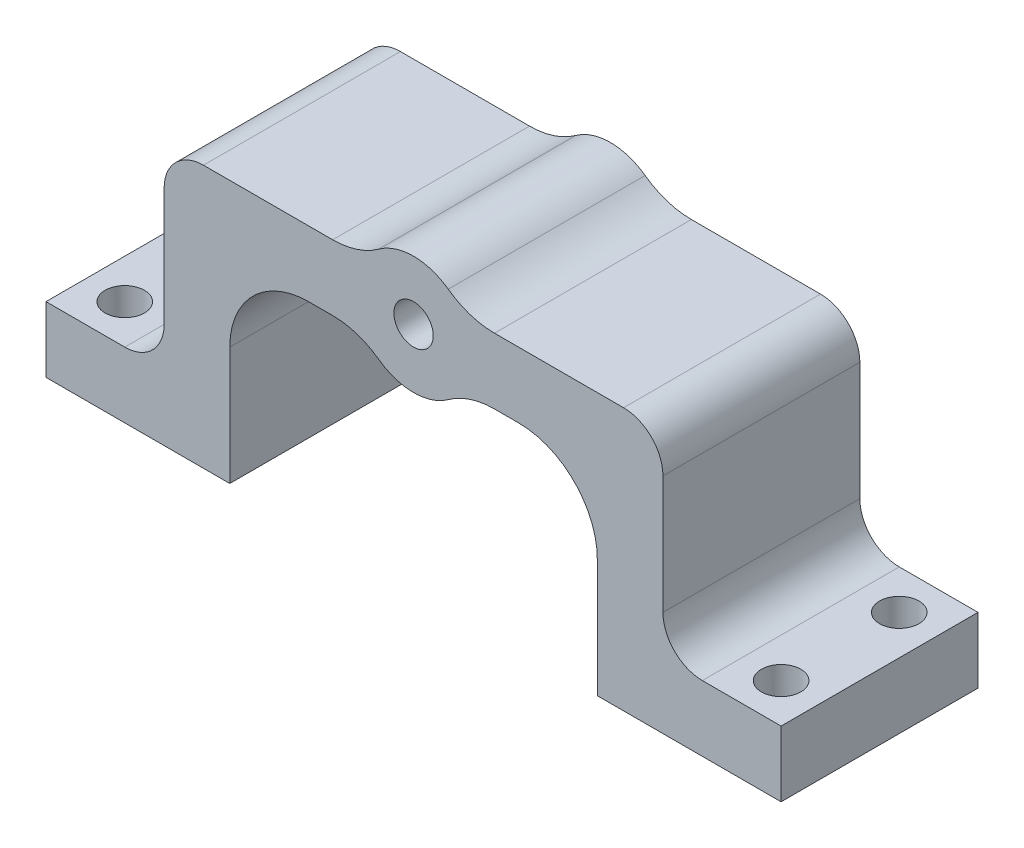
ISO-10303-21;
HEADER;
FILE_DESCRIPTION(('STEP AP214'),'2;1');
FILE_NAME('part.step','',(''),(''),'','','');
FILE_SCHEMA(('AUTOMOTIVE_DESIGN { 1 0 10303 214 1 1 1 1 }'));
ENDSEC;
DATA;
#1=APPLICATION_CONTEXT('core data for automotive mechanical design processes');
#2=APPLICATION_PROTOCOL_DEFINITION('international standard','automotive_design',2000,#1);
#3=PRODUCT_CONTEXT('',#1,'mechanical');
#4=PRODUCT('Part','Part','',(#3));
#5=PRODUCT_RELATED_PRODUCT_CATEGORY('part','',(#4));
#6=PRODUCT_DEFINITION_FORMATION('','',#4);
#7=PRODUCT_DEFINITION_CONTEXT('part definition',#1,'design');
#8=PRODUCT_DEFINITION('design','',#6,#7);
#9=PRODUCT_DEFINITION_SHAPE('','',#8);
#10=(LENGTH_UNIT() NAMED_UNIT(*) SI_UNIT(.MILLI.,.METRE.));
#11=(NAMED_UNIT(*) PLANE_ANGLE_UNIT() SI_UNIT($,.RADIAN.));
#12=(NAMED_UNIT(*) SI_UNIT($,.STERADIAN.) SOLID_ANGLE_UNIT());
#13=UNCERTAINTY_MEASURE_WITH_UNIT(LENGTH_MEASURE(1.E-05),#10,'distance_accuracy_value','');
#14=(GEOMETRIC_REPRESENTATION_CONTEXT(3) GLOBAL_UNCERTAINTY_ASSIGNED_CONTEXT((#13)) GLOBAL_UNIT_ASSIGNED_CONTEXT((#10,
#11,#12)) REPRESENTATION_CONTEXT('',''));
#15=CARTESIAN_POINT('',(0.,0.,0.));
#16=DIRECTION('',(0.,0.,1.));
#17=DIRECTION('',(1.,0.,0.));
#18=AXIS2_PLACEMENT_3D('',#15,#16,#17);
#19=CARTESIAN_POINT('',(0.,4.99999999999999,7.5));
#20=DIRECTION('',(0.,1.,0.));
#21=DIRECTION('',(-1.,0.,0.));
#22=AXIS2_PLACEMENT_3D('',#19,#20,#21);
#23=PLANE('',#22);
#24=CARTESIAN_POINT('',(-25.,5.,4.5));
#25=DIRECTION('',(0.,-1.,0.));
#26=DIRECTION('',(1.,0.,0.));
#27=AXIS2_PLACEMENT_3D('',#24,#25,#26);
#28=CIRCLE('',#27,1.5);
#29=CARTESIAN_POINT('',(-23.5,5.,4.5));
#30=VERTEX_POINT('',#29);
#31=EDGE_CURVE('E372',#30,#30,#28,.T.);
#32=ORIENTED_EDGE('',*,*,#31,.T.);
#33=EDGE_LOOP('',(#32));
#34=FACE_BOUND('',#33,.T.);
#35=DIRECTION('',(1.,0.,0.));
#36=VECTOR('',#35,1.);
#37=CARTESIAN_POINT('',(0.,4.99999999999999,7.5));
#38=LINE('',#37,#36);
#39=CARTESIAN_POINT('',(-28.,5.,7.5));
#40=VERTEX_POINT('',#39);
#41=CARTESIAN_POINT('',(-22.,5.,7.5));
#42=VERTEX_POINT('',#41);
#43=EDGE_CURVE('E258',#40,#42,#38,.T.);
#44=ORIENTED_EDGE('',*,*,#43,.T.);
#45=DIRECTION('',(0.,0.,-1.));
#46=VECTOR('',#45,1.);
#47=CARTESIAN_POINT('',(-22.,5.,-7.5));
#48=LINE('',#47,#46);
#49=CARTESIAN_POINT('',(-22.,5.,-7.5));
#50=VERTEX_POINT('',#49);
#51=EDGE_CURVE('E336',#42,#50,#48,.T.);
#52=ORIENTED_EDGE('',*,*,#51,.T.);
#53=DIRECTION('',(1.,0.,0.));
#54=VECTOR('',#53,1.);
#55=CARTESIAN_POINT('',(0.,4.99999999999999,-7.5));
#56=LINE('',#55,#54);
#57=CARTESIAN_POINT('',(-28.,5.,-7.5));
#58=VERTEX_POINT('',#57);
#59=EDGE_CURVE('E291',#58,#50,#56,.T.);
#60=ORIENTED_EDGE('',*,*,#59,.F.);
#61=DIRECTION('',(0.,0.,-1.));
#62=VECTOR('',#61,1.);
#63=CARTESIAN_POINT('',(-28.,5.,7.5));
#64=LINE('',#63,#62);
#65=EDGE_CURVE('E306',#40,#58,#64,.T.);
#66=ORIENTED_EDGE('',*,*,#65,.F.);
#67=EDGE_LOOP('',(#44,#52,#60,#66));
#68=FACE_BOUND('',#67,.T.);
#69=CARTESIAN_POINT('',(-25.,5.,-4.5));
#70=DIRECTION('',(0.,-1.,0.));
#71=DIRECTION('',(1.,0.,0.));
#72=AXIS2_PLACEMENT_3D('',#69,#70,#71);
#73=CIRCLE('',#72,1.5);
#74=CARTESIAN_POINT('',(-23.5,5.,-4.5));
#75=VERTEX_POINT('',#74);
#76=EDGE_CURVE('E376',#75,#75,#73,.T.);
#77=ORIENTED_EDGE('',*,*,#76,.T.);
#78=EDGE_LOOP('',(#77));
#79=FACE_BOUND('',#78,.T.);
#80=ADVANCED_FACE('F39',(#34,#68,#79),#23,.T.);
#81=CARTESIAN_POINT('',(0.,0.,7.5));
#82=DIRECTION('',(0.,1.,0.));
#83=DIRECTION('',(0.,0.,1.));
#84=AXIS2_PLACEMENT_3D('',#81,#82,#83);
#85=PLANE('',#84);
#86=CARTESIAN_POINT('',(-25.,0.,4.5));
#87=DIRECTION('',(0.,1.,0.));
#88=DIRECTION('',(0.,0.,1.));
#89=AXIS2_PLACEMENT_3D('',#86,#87,#88);
#90=CIRCLE('',#89,1.5);
#91=CARTESIAN_POINT('',(-25.,0.,6.));
#92=VERTEX_POINT('',#91);
#93=EDGE_CURVE('E368',#92,#92,#90,.F.);
#94=ORIENTED_EDGE('',*,*,#93,.F.);
#95=EDGE_LOOP('',(#94));
#96=FACE_BOUND('',#95,.T.);
#97=DIRECTION('',(1.,0.,0.));
#98=VECTOR('',#97,1.);
#99=CARTESIAN_POINT('',(0.,0.,-7.5));
#100=LINE('',#99,#98);
#101=CARTESIAN_POINT('',(-28.,0.,-7.5));
#102=VERTEX_POINT('',#101);
#103=CARTESIAN_POINT('',(-14.,0.,-7.5));
#104=VERTEX_POINT('',#103);
#105=EDGE_CURVE('E297',#102,#104,#100,.T.);
#106=ORIENTED_EDGE('',*,*,#105,.T.);
#107=DIRECTION('',(0.,0.,-1.));
#108=VECTOR('',#107,1.);
#109=CARTESIAN_POINT('',(-14.,0.,7.5));
#110=LINE('',#109,#108);
#111=CARTESIAN_POINT('',(-14.,0.,7.5));
#112=VERTEX_POINT('',#111);
#113=EDGE_CURVE('E269',#112,#104,#110,.T.);
#114=ORIENTED_EDGE('',*,*,#113,.F.);
#115=DIRECTION('',(1.,0.,0.));
#116=VECTOR('',#115,1.);
#117=CARTESIAN_POINT('',(0.,0.,7.5));
#118=LINE('',#117,#116);
#119=CARTESIAN_POINT('',(-28.,0.,7.5));
#120=VERTEX_POINT('',#119);
#121=EDGE_CURVE('E264',#120,#112,#118,.T.);
#122=ORIENTED_EDGE('',*,*,#121,.F.);
#123=DIRECTION('',(0.,0.,-1.));
#124=VECTOR('',#123,1.);
#125=CARTESIAN_POINT('',(-28.,0.,7.5));
#126=LINE('',#125,#124);
#127=EDGE_CURVE('E304',#120,#102,#126,.T.);
#128=ORIENTED_EDGE('',*,*,#127,.T.);
#129=EDGE_LOOP('',(#106,#114,#122,#128));
#130=FACE_BOUND('',#129,.T.);
#131=CARTESIAN_POINT('',(-25.,0.,-4.5));
#132=DIRECTION('',(0.,1.,0.));
#133=DIRECTION('',(0.,0.,1.));
#134=AXIS2_PLACEMENT_3D('',#131,#132,#133);
#135=CIRCLE('',#134,1.5);
#136=CARTESIAN_POINT('',(-25.,0.,-3.));
#137=VERTEX_POINT('',#136);
#138=EDGE_CURVE('E373',#137,#137,#135,.F.);
#139=ORIENTED_EDGE('',*,*,#138,.F.);
#140=EDGE_LOOP('',(#139));
#141=FACE_BOUND('',#140,.T.);
#142=ADVANCED_FACE('F486',(#96,#130,#141),#85,.F.);
#143=CARTESIAN_POINT('',(0.,15.,7.5));
#144=DIRECTION('',(0.,1.,0.));
#145=DIRECTION('',(0.,0.,1.));
#146=AXIS2_PLACEMENT_3D('',#143,#144,#145);
#147=PLANE('',#146);
#148=DIRECTION('',(1.,0.,0.));
#149=VECTOR('',#148,1.);
#150=CARTESIAN_POINT('',(0.,15.,-7.5));
#151=LINE('',#150,#149);
#152=CARTESIAN_POINT('',(-8.,15.,-7.5));
#153=VERTEX_POINT('',#152);
#154=CARTESIAN_POINT('',(-6.16441400296897,15.,-7.5));
#155=VERTEX_POINT('',#154);
#156=EDGE_CURVE('E270',#153,#155,#151,.T.);
#157=ORIENTED_EDGE('',*,*,#156,.T.);
#158=DIRECTION('',(0.,0.,1.));
#159=VECTOR('',#158,1.);
#160=CARTESIAN_POINT('',(-6.16441400296897,15.,7.5));
#161=LINE('',#160,#159);
#162=CARTESIAN_POINT('',(-6.16441400296897,15.,7.5));
#163=VERTEX_POINT('',#162);
#164=EDGE_CURVE('E383',#155,#163,#161,.T.);
#165=ORIENTED_EDGE('',*,*,#164,.T.);
#166=DIRECTION('',(1.,0.,0.));
#167=VECTOR('',#166,1.);
#168=CARTESIAN_POINT('',(0.,15.,7.5));
#169=LINE('',#168,#167);
#170=CARTESIAN_POINT('',(-8.,15.,7.5));
#171=VERTEX_POINT('',#170);
#172=EDGE_CURVE('E238',#171,#163,#169,.T.);
#173=ORIENTED_EDGE('',*,*,#172,.F.);
#174=DIRECTION('',(0.,0.,-1.));
#175=VECTOR('',#174,1.);
#176=CARTESIAN_POINT('',(-8.,15.,-7.5));
#177=LINE('',#176,#175);
#178=EDGE_CURVE('E351',#171,#153,#177,.T.);
#179=ORIENTED_EDGE('',*,*,#178,.T.);
#180=EDGE_LOOP('',(#157,#165,#173,#179));
#181=FACE_BOUND('',#180,.T.);
#182=ADVANCED_FACE('F488',(#181),#147,.F.);
#183=CARTESIAN_POINT('',(0.,20.,7.5));
#184=DIRECTION('',(0.,-1.,0.));
#185=DIRECTION('',(0.,0.,-1.));
#186=AXIS2_PLACEMENT_3D('',#183,#184,#185);
#187=PLANE('',#186);
#188=DIRECTION('',(-1.,0.,0.));
#189=VECTOR('',#188,1.);
#190=CARTESIAN_POINT('',(0.,20.,-7.5));
#191=LINE('',#190,#189);
#192=CARTESIAN_POINT('',(16.,20.,-7.5));
#193=VERTEX_POINT('',#192);
#194=CARTESIAN_POINT('',(6.16441400296898,20.,-7.5));
#195=VERTEX_POINT('',#194);
#196=EDGE_CURVE('E286',#193,#195,#191,.T.);
#197=ORIENTED_EDGE('',*,*,#196,.T.);
#198=DIRECTION('',(0.,0.,1.));
#199=VECTOR('',#198,1.);
#200=CARTESIAN_POINT('',(6.16441400296898,20.,7.5));
#201=LINE('',#200,#199);
#202=CARTESIAN_POINT('',(6.16441400296898,20.,7.5));
#203=VERTEX_POINT('',#202);
#204=EDGE_CURVE('E393',#195,#203,#201,.T.);
#205=ORIENTED_EDGE('',*,*,#204,.T.);
#206=DIRECTION('',(-1.,0.,0.));
#207=VECTOR('',#206,1.);
#208=CARTESIAN_POINT('',(0.,20.,7.5));
#209=LINE('',#208,#207);
#210=CARTESIAN_POINT('',(16.,20.,7.5));
#211=VERTEX_POINT('',#210);
#212=EDGE_CURVE('E253',#211,#203,#209,.T.);
#213=ORIENTED_EDGE('',*,*,#212,.F.);
#214=DIRECTION('',(0.,0.,-1.));
#215=VECTOR('',#214,1.);
#216=CARTESIAN_POINT('',(16.,20.,7.5));
#217=LINE('',#216,#215);
#218=EDGE_CURVE('E314',#211,#193,#217,.T.);
#219=ORIENTED_EDGE('',*,*,#218,.T.);
#220=EDGE_LOOP('',(#197,#205,#213,#219));
#221=FACE_BOUND('',#220,.T.);
#222=ADVANCED_FACE('F419',(#221),#187,.F.);
#223=CARTESIAN_POINT('',(6.16441400296897,15.,7.5));
#224=VERTEX_POINT('',#223);
#225=CARTESIAN_POINT('',(8.,15.,7.5));
#226=VERTEX_POINT('',#225);
#227=EDGE_CURVE('E241',#224,#226,#169,.T.);
#228=ORIENTED_EDGE('',*,*,#227,.F.);
#229=DIRECTION('',(0.,0.,1.));
#230=VECTOR('',#229,1.);
#231=CARTESIAN_POINT('',(6.16441400296897,15.,7.5));
#232=LINE('',#231,#230);
#233=CARTESIAN_POINT('',(6.16441400296897,15.,-7.5));
#234=VERTEX_POINT('',#233);
#235=EDGE_CURVE('E367',#224,#234,#232,.F.);
#236=ORIENTED_EDGE('',*,*,#235,.T.);
#237=CARTESIAN_POINT('',(8.,15.,-7.5));
#238=VERTEX_POINT('',#237);
#239=EDGE_CURVE('E273',#234,#238,#151,.T.);
#240=ORIENTED_EDGE('',*,*,#239,.T.);
#241=DIRECTION('',(0.,0.,-1.));
#242=VECTOR('',#241,1.);
#243=CARTESIAN_POINT('',(8.,15.,7.5));
#244=LINE('',#243,#242);
#245=EDGE_CURVE('E354',#238,#226,#244,.F.);
#246=ORIENTED_EDGE('',*,*,#245,.T.);
#247=EDGE_LOOP('',(#228,#236,#240,#246));
#248=FACE_BOUND('',#247,.T.);
#249=ADVANCED_FACE('F449',(#248),#147,.F.);
#250=CARTESIAN_POINT('',(14.,0.,7.5));
#251=DIRECTION('',(-1.,0.,0.));
#252=DIRECTION('',(0.,0.,1.));
#253=AXIS2_PLACEMENT_3D('',#250,#251,#252);
#254=PLANE('',#253);
#255=DIRECTION('',(0.,1.,0.));
#256=VECTOR('',#255,1.);
#257=CARTESIAN_POINT('',(14.,0.,7.5));
#258=LINE('',#257,#256);
#259=CARTESIAN_POINT('',(14.,0.,7.5));
#260=VERTEX_POINT('',#259);
#261=CARTESIAN_POINT('',(14.,9.,7.5));
#262=VERTEX_POINT('',#261);
#263=EDGE_CURVE('E217',#260,#262,#258,.T.);
#264=ORIENTED_EDGE('',*,*,#263,.T.);
#265=DIRECTION('',(0.,0.,-1.));
#266=VECTOR('',#265,1.);
#267=CARTESIAN_POINT('',(14.,9.,7.5));
#268=LINE('',#267,#266);
#269=CARTESIAN_POINT('',(14.,9.,-7.5));
#270=VERTEX_POINT('',#269);
#271=EDGE_CURVE('E349',#262,#270,#268,.T.);
#272=ORIENTED_EDGE('',*,*,#271,.T.);
#273=DIRECTION('',(0.,1.,0.));
#274=VECTOR('',#273,1.);
#275=CARTESIAN_POINT('',(14.,0.,-7.5));
#276=LINE('',#275,#274);
#277=CARTESIAN_POINT('',(14.,0.,-7.5));
#278=VERTEX_POINT('',#277);
#279=EDGE_CURVE('E220',#278,#270,#276,.T.);
#280=ORIENTED_EDGE('',*,*,#279,.F.);
#281=DIRECTION('',(0.,0.,-1.));
#282=VECTOR('',#281,1.);
#283=CARTESIAN_POINT('',(14.,0.,7.5));
#284=LINE('',#283,#282);
#285=EDGE_CURVE('E212',#260,#278,#284,.T.);
#286=ORIENTED_EDGE('',*,*,#285,.F.);
#287=EDGE_LOOP('',(#264,#272,#280,#286));
#288=FACE_BOUND('',#287,.T.);
#289=ADVANCED_FACE('F214',(#288),#254,.T.);
#290=CARTESIAN_POINT('',(0.,0.,7.5));
#291=DIRECTION('',(0.,1.,0.));
#292=DIRECTION('',(0.,0.,1.));
#293=AXIS2_PLACEMENT_3D('',#290,#291,#292);
#294=PLANE('',#293);
#295=CARTESIAN_POINT('',(25.,0.,-4.5));
#296=DIRECTION('',(0.,1.,0.));
#297=DIRECTION('',(0.,0.,1.));
#298=AXIS2_PLACEMENT_3D('',#295,#296,#297);
#299=CIRCLE('',#298,1.5);
#300=CARTESIAN_POINT('',(25.,0.,-3.));
#301=VERTEX_POINT('',#300);
#302=EDGE_CURVE('E457',#301,#301,#299,.T.);
#303=ORIENTED_EDGE('',*,*,#302,.T.);
#304=EDGE_LOOP('',(#303));
#305=FACE_BOUND('',#304,.T.);
#306=CARTESIAN_POINT('',(25.,0.,4.5));
#307=DIRECTION('',(0.,1.,0.));
#308=DIRECTION('',(0.,0.,1.));
#309=AXIS2_PLACEMENT_3D('',#306,#307,#308);
#310=CIRCLE('',#309,1.5);
#311=CARTESIAN_POINT('',(25.,0.,6.));
#312=VERTEX_POINT('',#311);
#313=EDGE_CURVE('E451',#312,#312,#310,.T.);
#314=ORIENTED_EDGE('',*,*,#313,.T.);
#315=EDGE_LOOP('',(#314));
#316=FACE_BOUND('',#315,.T.);
#317=DIRECTION('',(1.,0.,0.));
#318=VECTOR('',#317,1.);
#319=CARTESIAN_POINT('',(0.,0.,-7.5));
#320=LINE('',#319,#318);
#321=CARTESIAN_POINT('',(28.,0.,-7.5));
#322=VERTEX_POINT('',#321);
#323=EDGE_CURVE('E275',#278,#322,#320,.T.);
#324=ORIENTED_EDGE('',*,*,#323,.T.);
#325=DIRECTION('',(0.,0.,-1.));
#326=VECTOR('',#325,1.);
#327=CARTESIAN_POINT('',(28.,0.,7.5));
#328=LINE('',#327,#326);
#329=CARTESIAN_POINT('',(28.,0.,7.5));
#330=VERTEX_POINT('',#329);
#331=EDGE_CURVE('E224',#330,#322,#328,.T.);
#332=ORIENTED_EDGE('',*,*,#331,.F.);
#333=DIRECTION('',(1.,0.,0.));
#334=VECTOR('',#333,1.);
#335=CARTESIAN_POINT('',(0.,0.,7.5));
#336=LINE('',#335,#334);
#337=EDGE_CURVE('E227',#260,#330,#336,.T.);
#338=ORIENTED_EDGE('',*,*,#337,.F.);
#339=ORIENTED_EDGE('',*,*,#285,.T.);
#340=EDGE_LOOP('',(#324,#332,#338,#339));
#341=FACE_BOUND('',#340,.T.);
#342=ADVANCED_FACE('F228',(#305,#316,#341),#294,.F.);
#343=CARTESIAN_POINT('',(28.,0.,7.5));
#344=DIRECTION('',(-1.,0.,0.));
#345=DIRECTION('',(0.,0.,1.));
#346=AXIS2_PLACEMENT_3D('',#343,#344,#345);
#347=PLANE('',#346);
#348=DIRECTION('',(0.,1.,0.));
#349=VECTOR('',#348,1.);
#350=CARTESIAN_POINT('',(28.,0.,-7.5));
#351=LINE('',#350,#349);
#352=CARTESIAN_POINT('',(28.,5.,-7.5));
#353=VERTEX_POINT('',#352);
#354=EDGE_CURVE('E277',#322,#353,#351,.T.);
#355=ORIENTED_EDGE('',*,*,#354,.T.);
#356=DIRECTION('',(0.,0.,-1.));
#357=VECTOR('',#356,1.);
#358=CARTESIAN_POINT('',(28.,5.,7.5));
#359=LINE('',#358,#357);
#360=CARTESIAN_POINT('',(28.,5.,7.5));
#361=VERTEX_POINT('',#360);
#362=EDGE_CURVE('E308',#361,#353,#359,.T.);
#363=ORIENTED_EDGE('',*,*,#362,.F.);
#364=DIRECTION('',(0.,1.,0.));
#365=VECTOR('',#364,1.);
#366=CARTESIAN_POINT('',(28.,0.,7.5));
#367=LINE('',#366,#365);
#368=EDGE_CURVE('E232',#330,#361,#367,.T.);
#369=ORIENTED_EDGE('',*,*,#368,.F.);
#370=ORIENTED_EDGE('',*,*,#331,.T.);
#371=EDGE_LOOP('',(#355,#363,#369,#370));
#372=FACE_BOUND('',#371,.T.);
#373=ADVANCED_FACE('F443',(#372),#347,.F.);
#374=CARTESIAN_POINT('',(0.,4.99999999999999,7.5));
#375=DIRECTION('',(0.,-1.,0.));
#376=DIRECTION('',(1.,0.,0.));
#377=AXIS2_PLACEMENT_3D('',#374,#375,#376);
#378=PLANE('',#377);
#379=CARTESIAN_POINT('',(25.,5.,-4.5));
#380=DIRECTION('',(0.,1.,0.));
#381=DIRECTION('',(-1.,0.,0.));
#382=AXIS2_PLACEMENT_3D('',#379,#380,#381);
#383=CIRCLE('',#382,1.5);
#384=CARTESIAN_POINT('',(23.5,5.,-4.5));
#385=VERTEX_POINT('',#384);
#386=EDGE_CURVE('E462',#385,#385,#383,.T.);
#387=ORIENTED_EDGE('',*,*,#386,.F.);
#388=EDGE_LOOP('',(#387));
#389=FACE_BOUND('',#388,.T.);
#390=CARTESIAN_POINT('',(25.,5.,4.5));
#391=DIRECTION('',(0.,1.,0.));
#392=DIRECTION('',(-1.,0.,0.));
#393=AXIS2_PLACEMENT_3D('',#390,#391,#392);
#394=CIRCLE('',#393,1.5);
#395=CARTESIAN_POINT('',(23.5,5.,4.5));
#396=VERTEX_POINT('',#395);
#397=EDGE_CURVE('E453',#396,#396,#394,.T.);
#398=ORIENTED_EDGE('',*,*,#397,.F.);
#399=EDGE_LOOP('',(#398));
#400=FACE_BOUND('',#399,.T.);
#401=DIRECTION('',(-1.,0.,0.));
#402=VECTOR('',#401,1.);
#403=CARTESIAN_POINT('',(0.,4.99999999999999,-7.5));
#404=LINE('',#403,#402);
#405=CARTESIAN_POINT('',(22.,5.,-7.5));
#406=VERTEX_POINT('',#405);
#407=EDGE_CURVE('E279',#353,#406,#404,.T.);
#408=ORIENTED_EDGE('',*,*,#407,.T.);
#409=DIRECTION('',(0.,0.,-1.));
#410=VECTOR('',#409,1.);
#411=CARTESIAN_POINT('',(22.,5.,7.5));
#412=LINE('',#411,#410);
#413=CARTESIAN_POINT('',(22.,5.,7.5));
#414=VERTEX_POINT('',#413);
#415=EDGE_CURVE('E339',#406,#414,#412,.F.);
#416=ORIENTED_EDGE('',*,*,#415,.T.);
#417=DIRECTION('',(-1.,0.,0.));
#418=VECTOR('',#417,1.);
#419=CARTESIAN_POINT('',(0.,4.99999999999999,7.5));
#420=LINE('',#419,#418);
#421=EDGE_CURVE('E246',#361,#414,#420,.T.);
#422=ORIENTED_EDGE('',*,*,#421,.F.);
#423=ORIENTED_EDGE('',*,*,#362,.T.);
#424=EDGE_LOOP('',(#408,#416,#422,#423));
#425=FACE_BOUND('',#424,.T.);
#426=ADVANCED_FACE('F439',(#389,#400,#425),#378,.F.);
#427=CARTESIAN_POINT('',(19.,0.,7.5));
#428=DIRECTION('',(-1.,0.,0.));
#429=DIRECTION('',(0.,0.,1.));
#430=AXIS2_PLACEMENT_3D('',#427,#428,#429);
#431=PLANE('',#430);
#432=DIRECTION('',(0.,1.,0.));
#433=VECTOR('',#432,1.);
#434=CARTESIAN_POINT('',(19.,0.,-7.5));
#435=LINE('',#434,#433);
#436=CARTESIAN_POINT('',(19.,8.,-7.5));
#437=VERTEX_POINT('',#436);
#438=CARTESIAN_POINT('',(19.,17.,-7.5));
#439=VERTEX_POINT('',#438);
#440=EDGE_CURVE('E282',#437,#439,#435,.T.);
#441=ORIENTED_EDGE('',*,*,#440,.T.);
#442=DIRECTION('',(0.,0.,-1.));
#443=VECTOR('',#442,1.);
#444=CARTESIAN_POINT('',(19.,17.,7.5));
#445=LINE('',#444,#443);
#446=CARTESIAN_POINT('',(19.,17.,7.5));
#447=VERTEX_POINT('',#446);
#448=EDGE_CURVE('E325',#439,#447,#445,.F.);
#449=ORIENTED_EDGE('',*,*,#448,.T.);
#450=DIRECTION('',(0.,1.,0.));
#451=VECTOR('',#450,1.);
#452=CARTESIAN_POINT('',(19.,0.,7.5));
#453=LINE('',#452,#451);
#454=CARTESIAN_POINT('',(19.,8.,7.5));
#455=VERTEX_POINT('',#454);
#456=EDGE_CURVE('E249',#455,#447,#453,.T.);
#457=ORIENTED_EDGE('',*,*,#456,.F.);
#458=DIRECTION('',(0.,0.,-1.));
#459=VECTOR('',#458,1.);
#460=CARTESIAN_POINT('',(19.,8.,-7.5));
#461=LINE('',#460,#459);
#462=EDGE_CURVE('E322',#455,#437,#461,.T.);
#463=ORIENTED_EDGE('',*,*,#462,.T.);
#464=EDGE_LOOP('',(#441,#449,#457,#463));
#465=FACE_BOUND('',#464,.T.);
#466=ADVANCED_FACE('F427',(#465),#431,.F.);
#467=CARTESIAN_POINT('',(-6.16441400296898,20.,7.5));
#468=VERTEX_POINT('',#467);
#469=CARTESIAN_POINT('',(-16.,20.,7.5));
#470=VERTEX_POINT('',#469);
#471=EDGE_CURVE('E252',#468,#470,#209,.T.);
#472=ORIENTED_EDGE('',*,*,#471,.F.);
#473=DIRECTION('',(0.,0.,1.));
#474=VECTOR('',#473,1.);
#475=CARTESIAN_POINT('',(-6.16441400296898,20.,7.5));
#476=LINE('',#475,#474);
#477=CARTESIAN_POINT('',(-6.16441400296898,20.,-7.5));
#478=VERTEX_POINT('',#477);
#479=EDGE_CURVE('E386',#468,#478,#476,.F.);
#480=ORIENTED_EDGE('',*,*,#479,.T.);
#481=CARTESIAN_POINT('',(-16.,20.,-7.5));
#482=VERTEX_POINT('',#481);
#483=EDGE_CURVE('E285',#478,#482,#191,.T.);
#484=ORIENTED_EDGE('',*,*,#483,.T.);
#485=DIRECTION('',(0.,0.,-1.));
#486=VECTOR('',#485,1.);
#487=CARTESIAN_POINT('',(-16.,20.,7.5));
#488=LINE('',#487,#486);
#489=EDGE_CURVE('E223',#482,#470,#488,.F.);
#490=ORIENTED_EDGE('',*,*,#489,.T.);
#491=EDGE_LOOP('',(#472,#480,#484,#490));
#492=FACE_BOUND('',#491,.T.);
#493=ADVANCED_FACE('F512',(#492),#187,.F.);
#494=CARTESIAN_POINT('',(-19.,0.,7.5));
#495=DIRECTION('',(-1.,0.,0.));
#496=DIRECTION('',(0.,0.,1.));
#497=AXIS2_PLACEMENT_3D('',#494,#495,#496);
#498=PLANE('',#497);
#499=DIRECTION('',(0.,1.,0.));
#500=VECTOR('',#499,1.);
#501=CARTESIAN_POINT('',(-19.,0.,7.5));
#502=LINE('',#501,#500);
#503=CARTESIAN_POINT('',(-19.,8.,7.5));
#504=VERTEX_POINT('',#503);
#505=CARTESIAN_POINT('',(-19.,17.,7.5));
#506=VERTEX_POINT('',#505);
#507=EDGE_CURVE('E255',#504,#506,#502,.T.);
#508=ORIENTED_EDGE('',*,*,#507,.T.);
#509=DIRECTION('',(0.,0.,-1.));
#510=VECTOR('',#509,1.);
#511=CARTESIAN_POINT('',(-19.,17.,-7.5));
#512=LINE('',#511,#510);
#513=CARTESIAN_POINT('',(-19.,17.,-7.5));
#514=VERTEX_POINT('',#513);
#515=EDGE_CURVE('E333',#506,#514,#512,.T.);
#516=ORIENTED_EDGE('',*,*,#515,.T.);
#517=DIRECTION('',(0.,1.,0.));
#518=VECTOR('',#517,1.);
#519=CARTESIAN_POINT('',(-19.,0.,-7.5));
#520=LINE('',#519,#518);
#521=CARTESIAN_POINT('',(-19.,8.,-7.5));
#522=VERTEX_POINT('',#521);
#523=EDGE_CURVE('E288',#522,#514,#520,.T.);
#524=ORIENTED_EDGE('',*,*,#523,.F.);
#525=DIRECTION('',(0.,0.,-1.));
#526=VECTOR('',#525,1.);
#527=CARTESIAN_POINT('',(-19.,8.,7.5));
#528=LINE('',#527,#526);
#529=EDGE_CURVE('E331',#522,#504,#528,.F.);
#530=ORIENTED_EDGE('',*,*,#529,.T.);
#531=EDGE_LOOP('',(#508,#516,#524,#530));
#532=FACE_BOUND('',#531,.T.);
#533=ADVANCED_FACE('F507',(#532),#498,.T.);
#534=CARTESIAN_POINT('',(-28.,0.,7.5));
#535=DIRECTION('',(-1.,0.,0.));
#536=DIRECTION('',(0.,0.,1.));
#537=AXIS2_PLACEMENT_3D('',#534,#535,#536);
#538=PLANE('',#537);
#539=DIRECTION('',(0.,1.,0.));
#540=VECTOR('',#539,1.);
#541=CARTESIAN_POINT('',(-28.,0.,-7.5));
#542=LINE('',#541,#540);
#543=EDGE_CURVE('E294',#102,#58,#542,.T.);
#544=ORIENTED_EDGE('',*,*,#543,.F.);
#545=ORIENTED_EDGE('',*,*,#127,.F.);
#546=DIRECTION('',(0.,1.,0.));
#547=VECTOR('',#546,1.);
#548=CARTESIAN_POINT('',(-28.,0.,7.5));
#549=LINE('',#548,#547);
#550=EDGE_CURVE('E261',#120,#40,#549,.T.);
#551=ORIENTED_EDGE('',*,*,#550,.T.);
#552=ORIENTED_EDGE('',*,*,#65,.T.);
#553=EDGE_LOOP('',(#544,#545,#551,#552));
#554=FACE_BOUND('',#553,.T.);
#555=ADVANCED_FACE('F505',(#554),#538,.T.);
#556=CARTESIAN_POINT('',(-14.,0.,7.5));
#557=DIRECTION('',(-1.,0.,0.));
#558=DIRECTION('',(0.,0.,1.));
#559=AXIS2_PLACEMENT_3D('',#556,#557,#558);
#560=PLANE('',#559);
#561=DIRECTION('',(0.,1.,0.));
#562=VECTOR('',#561,1.);
#563=CARTESIAN_POINT('',(-14.,0.,-7.5));
#564=LINE('',#563,#562);
#565=CARTESIAN_POINT('',(-14.,9.,-7.5));
#566=VERTEX_POINT('',#565);
#567=EDGE_CURVE('E299',#104,#566,#564,.T.);
#568=ORIENTED_EDGE('',*,*,#567,.T.);
#569=DIRECTION('',(0.,0.,-1.));
#570=VECTOR('',#569,1.);
#571=CARTESIAN_POINT('',(-14.,9.,7.5));
#572=LINE('',#571,#570);
#573=CARTESIAN_POINT('',(-14.,9.,7.5));
#574=VERTEX_POINT('',#573);
#575=EDGE_CURVE('E357',#566,#574,#572,.F.);
#576=ORIENTED_EDGE('',*,*,#575,.T.);
#577=DIRECTION('',(0.,1.,0.));
#578=VECTOR('',#577,1.);
#579=CARTESIAN_POINT('',(-14.,0.,7.5));
#580=LINE('',#579,#578);
#581=EDGE_CURVE('E266',#112,#574,#580,.T.);
#582=ORIENTED_EDGE('',*,*,#581,.F.);
#583=ORIENTED_EDGE('',*,*,#113,.T.);
#584=EDGE_LOOP('',(#568,#576,#582,#583));
#585=FACE_BOUND('',#584,.T.);
#586=ADVANCED_FACE('F503',(#585),#560,.F.);
#587=CARTESIAN_POINT('',(0.,0.,7.5));
#588=DIRECTION('',(0.,0.,1.));
#589=DIRECTION('',(1.,0.,0.));
#590=AXIS2_PLACEMENT_3D('',#587,#588,#589);
#591=PLANE('',#590);
#592=CARTESIAN_POINT('',(0.,17.5,7.5));
#593=DIRECTION('',(0.,0.,1.));
#594=DIRECTION('',(1.,0.,0.));
#595=AXIS2_PLACEMENT_3D('',#592,#593,#594);
#596=CIRCLE('',#595,1.5);
#597=CARTESIAN_POINT('',(1.5,17.5,7.5));
#598=VERTEX_POINT('',#597);
#599=EDGE_CURVE('E371',#598,#598,#596,.T.);
#600=ORIENTED_EDGE('',*,*,#599,.F.);
#601=EDGE_LOOP('',(#600));
#602=FACE_BOUND('',#601,.T.);
#603=ORIENTED_EDGE('',*,*,#212,.T.);
#604=CARTESIAN_POINT('',(6.16441400296898,26.,7.5));
#605=DIRECTION('',(0.,0.,1.));
#606=DIRECTION('',(1.,0.,0.));
#607=AXIS2_PLACEMENT_3D('',#604,#605,#606);
#608=CIRCLE('',#607,6.);
#609=CARTESIAN_POINT('',(2.64189171555813,21.1428571428571,7.5));
#610=VERTEX_POINT('',#609);
#611=EDGE_CURVE('E47',#203,#610,#608,.F.);
#612=ORIENTED_EDGE('',*,*,#611,.T.);
#613=CARTESIAN_POINT('',(0.,17.5,7.5));
#614=DIRECTION('',(0.,0.,1.));
#615=DIRECTION('',(1.,0.,0.));
#616=AXIS2_PLACEMENT_3D('',#613,#614,#615);
#617=CIRCLE('',#616,4.5);
#618=CARTESIAN_POINT('',(-2.64189171555814,21.1428571428571,7.5));
#619=VERTEX_POINT('',#618);
#620=EDGE_CURVE('E408',#610,#619,#617,.T.);
#621=ORIENTED_EDGE('',*,*,#620,.T.);
#622=CARTESIAN_POINT('',(-6.16441400296898,26.,7.5));
#623=DIRECTION('',(0.,0.,1.));
#624=DIRECTION('',(1.,0.,0.));
#625=AXIS2_PLACEMENT_3D('',#622,#623,#624);
#626=CIRCLE('',#625,6.);
#627=EDGE_CURVE('E405',#619,#468,#626,.F.);
#628=ORIENTED_EDGE('',*,*,#627,.T.);
#629=ORIENTED_EDGE('',*,*,#471,.T.);
#630=CARTESIAN_POINT('',(-16.,17.,7.5));
#631=DIRECTION('',(0.,0.,1.));
#632=DIRECTION('',(1.,0.,0.));
#633=AXIS2_PLACEMENT_3D('',#630,#631,#632);
#634=CIRCLE('',#633,3.);
#635=EDGE_CURVE('E327',#470,#506,#634,.T.);
#636=ORIENTED_EDGE('',*,*,#635,.T.);
#637=ORIENTED_EDGE('',*,*,#507,.F.);
#638=CARTESIAN_POINT('',(-22.,8.,7.5));
#639=DIRECTION('',(0.,0.,1.));
#640=DIRECTION('',(1.,0.,0.));
#641=AXIS2_PLACEMENT_3D('',#638,#639,#640);
#642=CIRCLE('',#641,3.);
#643=EDGE_CURVE('E343',#504,#42,#642,.F.);
#644=ORIENTED_EDGE('',*,*,#643,.T.);
#645=ORIENTED_EDGE('',*,*,#43,.F.);
#646=ORIENTED_EDGE('',*,*,#550,.F.);
#647=ORIENTED_EDGE('',*,*,#121,.T.);
#648=ORIENTED_EDGE('',*,*,#581,.T.);
#649=CARTESIAN_POINT('',(-8.,9.,7.5));
#650=DIRECTION('',(0.,0.,1.));
#651=DIRECTION('',(1.,0.,0.));
#652=AXIS2_PLACEMENT_3D('',#649,#650,#651);
#653=CIRCLE('',#652,6.);
#654=EDGE_CURVE('E365',#574,#171,#653,.F.);
#655=ORIENTED_EDGE('',*,*,#654,.T.);
#656=ORIENTED_EDGE('',*,*,#172,.T.);
#657=CARTESIAN_POINT('',(-6.16441400296897,9.,7.5));
#658=DIRECTION('',(0.,0.,1.));
#659=DIRECTION('',(1.,0.,0.));
#660=AXIS2_PLACEMENT_3D('',#657,#658,#659);
#661=CIRCLE('',#660,6.);
#662=CARTESIAN_POINT('',(-2.64189171555813,13.8571428571429,7.5));
#663=VERTEX_POINT('',#662);
#664=EDGE_CURVE('E399',#163,#663,#661,.F.);
#665=ORIENTED_EDGE('',*,*,#664,.T.);
#666=CARTESIAN_POINT('',(2.64189171555813,13.8571428571429,7.5));
#667=VERTEX_POINT('',#666);
#668=EDGE_CURVE('E416',#663,#667,#617,.T.);
#669=ORIENTED_EDGE('',*,*,#668,.T.);
#670=CARTESIAN_POINT('',(6.16441400296897,9.,7.5));
#671=DIRECTION('',(0.,0.,1.));
#672=DIRECTION('',(1.,0.,0.));
#673=AXIS2_PLACEMENT_3D('',#670,#671,#672);
#674=CIRCLE('',#673,6.);
#675=EDGE_CURVE('E397',#667,#224,#674,.F.);
#676=ORIENTED_EDGE('',*,*,#675,.T.);
#677=ORIENTED_EDGE('',*,*,#227,.T.);
#678=CARTESIAN_POINT('',(8.,9.,7.5));
#679=DIRECTION('',(0.,0.,1.));
#680=DIRECTION('',(1.,0.,0.));
#681=AXIS2_PLACEMENT_3D('',#678,#679,#680);
#682=CIRCLE('',#681,6.);
#683=EDGE_CURVE('E237',#226,#262,#682,.F.);
#684=ORIENTED_EDGE('',*,*,#683,.T.);
#685=ORIENTED_EDGE('',*,*,#263,.F.);
#686=ORIENTED_EDGE('',*,*,#337,.T.);
#687=ORIENTED_EDGE('',*,*,#368,.T.);
#688=ORIENTED_EDGE('',*,*,#421,.T.);
#689=CARTESIAN_POINT('',(22.,8.,7.5));
#690=DIRECTION('',(0.,0.,1.));
#691=DIRECTION('',(1.,0.,0.));
#692=AXIS2_PLACEMENT_3D('',#689,#690,#691);
#693=CIRCLE('',#692,3.);
#694=EDGE_CURVE('E347',#414,#455,#693,.F.);
#695=ORIENTED_EDGE('',*,*,#694,.T.);
#696=ORIENTED_EDGE('',*,*,#456,.T.);
#697=CARTESIAN_POINT('',(16.,17.,7.5));
#698=DIRECTION('',(0.,0.,1.));
#699=DIRECTION('',(1.,0.,0.));
#700=AXIS2_PLACEMENT_3D('',#697,#698,#699);
#701=CIRCLE('',#700,3.);
#702=EDGE_CURVE('E329',#447,#211,#701,.T.);
#703=ORIENTED_EDGE('',*,*,#702,.T.);
#704=EDGE_LOOP('',(#603,#612,#621,#628,#629,#636,#637,#644,#645,#646,#647,#648,#655,#656,#665,
#669,#676,#677,#684,#685,#686,#687,#688,#695,#696,#703));
#705=FACE_BOUND('',#704,.T.);
#706=ADVANCED_FACE('F235',(#602,#705),#591,.T.);
#707=CARTESIAN_POINT('',(0.,0.,-7.5));
#708=DIRECTION('',(0.,0.,1.));
#709=DIRECTION('',(1.,0.,0.));
#710=AXIS2_PLACEMENT_3D('',#707,#708,#709);
#711=PLANE('',#710);
#712=CARTESIAN_POINT('',(0.,17.5,-7.5));
#713=DIRECTION('',(0.,0.,1.));
#714=DIRECTION('',(1.,0.,0.));
#715=AXIS2_PLACEMENT_3D('',#712,#713,#714);
#716=CIRCLE('',#715,1.5);
#717=CARTESIAN_POINT('',(1.5,17.5,-7.5));
#718=VERTEX_POINT('',#717);
#719=EDGE_CURVE('E469',#718,#718,#716,.T.);
#720=ORIENTED_EDGE('',*,*,#719,.T.);
#721=EDGE_LOOP('',(#720));
#722=FACE_BOUND('',#721,.T.);
#723=ORIENTED_EDGE('',*,*,#239,.F.);
#724=CARTESIAN_POINT('',(6.16441400296897,9.,-7.5));
#725=DIRECTION('',(0.,0.,1.));
#726=DIRECTION('',(1.,0.,0.));
#727=AXIS2_PLACEMENT_3D('',#724,#725,#726);
#728=CIRCLE('',#727,6.);
#729=CARTESIAN_POINT('',(2.64189171555813,13.8571428571429,-7.5));
#730=VERTEX_POINT('',#729);
#731=EDGE_CURVE('E395',#234,#730,#728,.T.);
#732=ORIENTED_EDGE('',*,*,#731,.T.);
#733=CARTESIAN_POINT('',(0.,17.5,-7.5));
#734=DIRECTION('',(0.,0.,1.));
#735=DIRECTION('',(1.,0.,0.));
#736=AXIS2_PLACEMENT_3D('',#733,#734,#735);
#737=CIRCLE('',#736,4.5);
#738=CARTESIAN_POINT('',(-2.64189171555813,13.8571428571429,-7.5));
#739=VERTEX_POINT('',#738);
#740=EDGE_CURVE('E415',#739,#730,#737,.T.);
#741=ORIENTED_EDGE('',*,*,#740,.F.);
#742=CARTESIAN_POINT('',(-6.16441400296897,9.,-7.5));
#743=DIRECTION('',(0.,0.,1.));
#744=DIRECTION('',(1.,0.,0.));
#745=AXIS2_PLACEMENT_3D('',#742,#743,#744);
#746=CIRCLE('',#745,6.);
#747=EDGE_CURVE('E401',#739,#155,#746,.T.);
#748=ORIENTED_EDGE('',*,*,#747,.T.);
#749=ORIENTED_EDGE('',*,*,#156,.F.);
#750=CARTESIAN_POINT('',(-8.,9.,-7.5));
#751=DIRECTION('',(0.,0.,1.));
#752=DIRECTION('',(1.,0.,0.));
#753=AXIS2_PLACEMENT_3D('',#750,#751,#752);
#754=CIRCLE('',#753,6.);
#755=EDGE_CURVE('E363',#153,#566,#754,.T.);
#756=ORIENTED_EDGE('',*,*,#755,.T.);
#757=ORIENTED_EDGE('',*,*,#567,.F.);
#758=ORIENTED_EDGE('',*,*,#105,.F.);
#759=ORIENTED_EDGE('',*,*,#543,.T.);
#760=ORIENTED_EDGE('',*,*,#59,.T.);
#761=CARTESIAN_POINT('',(-22.,8.,-7.5));
#762=DIRECTION('',(0.,0.,1.));
#763=DIRECTION('',(1.,0.,0.));
#764=AXIS2_PLACEMENT_3D('',#761,#762,#763);
#765=CIRCLE('',#764,3.);
#766=EDGE_CURVE('E341',#50,#522,#765,.T.);
#767=ORIENTED_EDGE('',*,*,#766,.T.);
#768=ORIENTED_EDGE('',*,*,#523,.T.);
#769=CARTESIAN_POINT('',(-16.,17.,-7.5));
#770=DIRECTION('',(0.,0.,1.));
#771=DIRECTION('',(1.,0.,0.));
#772=AXIS2_PLACEMENT_3D('',#769,#770,#771);
#773=CIRCLE('',#772,3.);
#774=EDGE_CURVE('E317',#514,#482,#773,.F.);
#775=ORIENTED_EDGE('',*,*,#774,.T.);
#776=ORIENTED_EDGE('',*,*,#483,.F.);
#777=CARTESIAN_POINT('',(-6.16441400296898,26.,-7.5));
#778=DIRECTION('',(0.,0.,1.));
#779=DIRECTION('',(1.,0.,0.));
#780=AXIS2_PLACEMENT_3D('',#777,#778,#779);
#781=CIRCLE('',#780,6.);
#782=CARTESIAN_POINT('',(-2.64189171555814,21.1428571428571,-7.5));
#783=VERTEX_POINT('',#782);
#784=EDGE_CURVE('E403',#478,#783,#781,.T.);
#785=ORIENTED_EDGE('',*,*,#784,.T.);
#786=CARTESIAN_POINT('',(2.64189171555813,21.1428571428571,-7.5));
#787=VERTEX_POINT('',#786);
#788=EDGE_CURVE('E464',#787,#783,#737,.T.);
#789=ORIENTED_EDGE('',*,*,#788,.F.);
#790=CARTESIAN_POINT('',(6.16441400296898,26.,-7.5));
#791=DIRECTION('',(0.,0.,1.));
#792=DIRECTION('',(1.,0.,0.));
#793=AXIS2_PLACEMENT_3D('',#790,#791,#792);
#794=CIRCLE('',#793,6.);
#795=EDGE_CURVE('E12',#787,#195,#794,.T.);
#796=ORIENTED_EDGE('',*,*,#795,.T.);
#797=ORIENTED_EDGE('',*,*,#196,.F.);
#798=CARTESIAN_POINT('',(16.,17.,-7.5));
#799=DIRECTION('',(0.,0.,1.));
#800=DIRECTION('',(1.,0.,0.));
#801=AXIS2_PLACEMENT_3D('',#798,#799,#800);
#802=CIRCLE('',#801,3.);
#803=EDGE_CURVE('E320',#193,#439,#802,.F.);
#804=ORIENTED_EDGE('',*,*,#803,.T.);
#805=ORIENTED_EDGE('',*,*,#440,.F.);
#806=CARTESIAN_POINT('',(22.,8.,-7.5));
#807=DIRECTION('',(0.,0.,1.));
#808=DIRECTION('',(1.,0.,0.));
#809=AXIS2_PLACEMENT_3D('',#806,#807,#808);
#810=CIRCLE('',#809,3.);
#811=EDGE_CURVE('E345',#437,#406,#810,.T.);
#812=ORIENTED_EDGE('',*,*,#811,.T.);
#813=ORIENTED_EDGE('',*,*,#407,.F.);
#814=ORIENTED_EDGE('',*,*,#354,.F.);
#815=ORIENTED_EDGE('',*,*,#323,.F.);
#816=ORIENTED_EDGE('',*,*,#279,.T.);
#817=CARTESIAN_POINT('',(8.,9.,-7.5));
#818=DIRECTION('',(0.,0.,1.));
#819=DIRECTION('',(1.,0.,0.));
#820=AXIS2_PLACEMENT_3D('',#817,#818,#819);
#821=CIRCLE('',#820,6.);
#822=EDGE_CURVE('E359',#270,#238,#821,.T.);
#823=ORIENTED_EDGE('',*,*,#822,.T.);
#824=EDGE_LOOP('',(#723,#732,#741,#748,#749,#756,#757,#758,#759,#760,#767,#768,#775,#776,#785,
#789,#796,#797,#804,#805,#812,#813,#814,#815,#816,#823));
#825=FACE_BOUND('',#824,.T.);
#826=ADVANCED_FACE('F422',(#722,#825),#711,.F.);
#827=CARTESIAN_POINT('',(16.,17.,7.5));
#828=DIRECTION('',(0.,0.,-1.));
#829=DIRECTION('',(-1.,0.,0.));
#830=AXIS2_PLACEMENT_3D('',#827,#828,#829);
#831=CYLINDRICAL_SURFACE('',#830,3.);
#832=ORIENTED_EDGE('',*,*,#702,.F.);
#833=ORIENTED_EDGE('',*,*,#448,.F.);
#834=ORIENTED_EDGE('',*,*,#803,.F.);
#835=ORIENTED_EDGE('',*,*,#218,.F.);
#836=EDGE_LOOP('',(#832,#833,#834,#835));
#837=FACE_BOUND('',#836,.T.);
#838=ADVANCED_FACE('F431',(#837),#831,.T.);
#839=CARTESIAN_POINT('',(-16.,17.,7.5));
#840=DIRECTION('',(0.,0.,1.));
#841=DIRECTION('',(1.,0.,0.));
#842=AXIS2_PLACEMENT_3D('',#839,#840,#841);
#843=CYLINDRICAL_SURFACE('',#842,3.);
#844=ORIENTED_EDGE('',*,*,#635,.F.);
#845=ORIENTED_EDGE('',*,*,#489,.F.);
#846=ORIENTED_EDGE('',*,*,#774,.F.);
#847=ORIENTED_EDGE('',*,*,#515,.F.);
#848=EDGE_LOOP('',(#844,#845,#846,#847));
#849=FACE_BOUND('',#848,.T.);
#850=ADVANCED_FACE('F532',(#849),#843,.T.);
#851=CARTESIAN_POINT('',(-22.,8.,7.5));
#852=DIRECTION('',(0.,0.,1.));
#853=DIRECTION('',(1.,0.,0.));
#854=AXIS2_PLACEMENT_3D('',#851,#852,#853);
#855=CYLINDRICAL_SURFACE('',#854,3.);
#856=ORIENTED_EDGE('',*,*,#643,.F.);
#857=ORIENTED_EDGE('',*,*,#529,.F.);
#858=ORIENTED_EDGE('',*,*,#766,.F.);
#859=ORIENTED_EDGE('',*,*,#51,.F.);
#860=EDGE_LOOP('',(#856,#857,#858,#859));
#861=FACE_BOUND('',#860,.T.);
#862=ADVANCED_FACE('F535',(#861),#855,.F.);
#863=CARTESIAN_POINT('',(22.,8.,7.5));
#864=DIRECTION('',(0.,0.,1.));
#865=DIRECTION('',(1.,0.,0.));
#866=AXIS2_PLACEMENT_3D('',#863,#864,#865);
#867=CYLINDRICAL_SURFACE('',#866,3.);
#868=ORIENTED_EDGE('',*,*,#694,.F.);
#869=ORIENTED_EDGE('',*,*,#415,.F.);
#870=ORIENTED_EDGE('',*,*,#811,.F.);
#871=ORIENTED_EDGE('',*,*,#462,.F.);
#872=EDGE_LOOP('',(#868,#869,#870,#871));
#873=FACE_BOUND('',#872,.T.);
#874=ADVANCED_FACE('F434',(#873),#867,.F.);
#875=CARTESIAN_POINT('',(8.,9.,7.5));
#876=DIRECTION('',(0.,0.,-1.));
#877=DIRECTION('',(-1.,0.,0.));
#878=AXIS2_PLACEMENT_3D('',#875,#876,#877);
#879=CYLINDRICAL_SURFACE('',#878,6.);
#880=ORIENTED_EDGE('',*,*,#683,.F.);
#881=ORIENTED_EDGE('',*,*,#245,.F.);
#882=ORIENTED_EDGE('',*,*,#822,.F.);
#883=ORIENTED_EDGE('',*,*,#271,.F.);
#884=EDGE_LOOP('',(#880,#881,#882,#883));
#885=FACE_BOUND('',#884,.T.);
#886=ADVANCED_FACE('F446',(#885),#879,.F.);
#887=CARTESIAN_POINT('',(-8.,9.,7.5));
#888=DIRECTION('',(0.,0.,1.));
#889=DIRECTION('',(1.,0.,0.));
#890=AXIS2_PLACEMENT_3D('',#887,#888,#889);
#891=CYLINDRICAL_SURFACE('',#890,6.);
#892=ORIENTED_EDGE('',*,*,#654,.F.);
#893=ORIENTED_EDGE('',*,*,#575,.F.);
#894=ORIENTED_EDGE('',*,*,#755,.F.);
#895=ORIENTED_EDGE('',*,*,#178,.F.);
#896=EDGE_LOOP('',(#892,#893,#894,#895));
#897=FACE_BOUND('',#896,.T.);
#898=ADVANCED_FACE('F544',(#897),#891,.F.);
#899=CARTESIAN_POINT('',(25.,-5.,4.5));
#900=DIRECTION('',(0.,1.,0.));
#901=DIRECTION('',(-1.,0.,0.));
#902=AXIS2_PLACEMENT_3D('',#899,#900,#901);
#903=CYLINDRICAL_SURFACE('',#902,1.5);
#904=ORIENTED_EDGE('',*,*,#397,.T.);
#905=EDGE_LOOP('',(#904));
#906=FACE_BOUND('',#905,.T.);
#907=ORIENTED_EDGE('',*,*,#313,.F.);
#908=EDGE_LOOP('',(#907));
#909=FACE_BOUND('',#908,.T.);
#910=ADVANCED_FACE('F547',(#906,#909),#903,.F.);
#911=CARTESIAN_POINT('',(25.,-5.,-4.5));
#912=DIRECTION('',(0.,1.,0.));
#913=DIRECTION('',(-1.,0.,0.));
#914=AXIS2_PLACEMENT_3D('',#911,#912,#913);
#915=CYLINDRICAL_SURFACE('',#914,1.5);
#916=ORIENTED_EDGE('',*,*,#386,.T.);
#917=EDGE_LOOP('',(#916));
#918=FACE_BOUND('',#917,.T.);
#919=ORIENTED_EDGE('',*,*,#302,.F.);
#920=EDGE_LOOP('',(#919));
#921=FACE_BOUND('',#920,.T.);
#922=ADVANCED_FACE('F608',(#918,#921),#915,.F.);
#923=CARTESIAN_POINT('',(0.,17.5,-7.5));
#924=DIRECTION('',(0.,0.,1.));
#925=DIRECTION('',(1.,0.,0.));
#926=AXIS2_PLACEMENT_3D('',#923,#924,#925);
#927=CYLINDRICAL_SURFACE('',#926,4.5);
#928=ORIENTED_EDGE('',*,*,#788,.T.);
#929=DIRECTION('',(0.,0.,1.));
#930=VECTOR('',#929,1.);
#931=CARTESIAN_POINT('',(-2.64189171555814,21.1428571428571,-7.5));
#932=LINE('',#931,#930);
#933=EDGE_CURVE('E391',#783,#619,#932,.T.);
#934=ORIENTED_EDGE('',*,*,#933,.T.);
#935=ORIENTED_EDGE('',*,*,#620,.F.);
#936=DIRECTION('',(0.,0.,1.));
#937=VECTOR('',#936,1.);
#938=CARTESIAN_POINT('',(2.64189171555813,21.1428571428571,-7.5));
#939=LINE('',#938,#937);
#940=EDGE_CURVE('E389',#610,#787,#939,.F.);
#941=ORIENTED_EDGE('',*,*,#940,.T.);
#942=EDGE_LOOP('',(#928,#934,#935,#941));
#943=FACE_BOUND('',#942,.T.);
#944=ADVANCED_FACE('F413',(#943),#927,.T.);
#945=ORIENTED_EDGE('',*,*,#740,.T.);
#946=DIRECTION('',(0.,0.,1.));
#947=VECTOR('',#946,1.);
#948=CARTESIAN_POINT('',(2.64189171555813,13.8571428571429,-7.5));
#949=LINE('',#948,#947);
#950=EDGE_CURVE('E381',#730,#667,#949,.T.);
#951=ORIENTED_EDGE('',*,*,#950,.T.);
#952=ORIENTED_EDGE('',*,*,#668,.F.);
#953=DIRECTION('',(0.,0.,1.));
#954=VECTOR('',#953,1.);
#955=CARTESIAN_POINT('',(-2.64189171555813,13.8571428571429,-7.5));
#956=LINE('',#955,#954);
#957=EDGE_CURVE('E379',#663,#739,#956,.F.);
#958=ORIENTED_EDGE('',*,*,#957,.T.);
#959=EDGE_LOOP('',(#945,#951,#952,#958));
#960=FACE_BOUND('',#959,.T.);
#961=ADVANCED_FACE('F596',(#960),#927,.T.);
#962=CARTESIAN_POINT('',(0.,17.5,-7.5));
#963=DIRECTION('',(0.,0.,1.));
#964=DIRECTION('',(1.,0.,0.));
#965=AXIS2_PLACEMENT_3D('',#962,#963,#964);
#966=CYLINDRICAL_SURFACE('',#965,1.5);
#967=ORIENTED_EDGE('',*,*,#719,.F.);
#968=EDGE_LOOP('',(#967));
#969=FACE_BOUND('',#968,.T.);
#970=ORIENTED_EDGE('',*,*,#599,.T.);
#971=EDGE_LOOP('',(#970));
#972=FACE_BOUND('',#971,.T.);
#973=ADVANCED_FACE('F600',(#969,#972),#966,.F.);
#974=CARTESIAN_POINT('',(-25.,-5.,4.5));
#975=DIRECTION('',(0.,1.,0.));
#976=DIRECTION('',(-1.,0.,0.));
#977=AXIS2_PLACEMENT_3D('',#974,#975,#976);
#978=CYLINDRICAL_SURFACE('',#977,1.5);
#979=ORIENTED_EDGE('',*,*,#31,.F.);
#980=EDGE_LOOP('',(#979));
#981=FACE_BOUND('',#980,.T.);
#982=ORIENTED_EDGE('',*,*,#93,.T.);
#983=EDGE_LOOP('',(#982));
#984=FACE_BOUND('',#983,.T.);
#985=ADVANCED_FACE('F482',(#981,#984),#978,.F.);
#986=CARTESIAN_POINT('',(-25.,-5.,-4.5));
#987=DIRECTION('',(0.,1.,0.));
#988=DIRECTION('',(-1.,0.,0.));
#989=AXIS2_PLACEMENT_3D('',#986,#987,#988);
#990=CYLINDRICAL_SURFACE('',#989,1.5);
#991=ORIENTED_EDGE('',*,*,#76,.F.);
#992=EDGE_LOOP('',(#991));
#993=FACE_BOUND('',#992,.T.);
#994=ORIENTED_EDGE('',*,*,#138,.T.);
#995=EDGE_LOOP('',(#994));
#996=FACE_BOUND('',#995,.T.);
#997=ADVANCED_FACE('F478',(#993,#996),#990,.F.);
#998=CARTESIAN_POINT('',(6.16441400296897,9.,-7.5));
#999=DIRECTION('',(0.,0.,1.));
#1000=DIRECTION('',(1.,0.,0.));
#1001=AXIS2_PLACEMENT_3D('',#998,#999,#1000);
#1002=CYLINDRICAL_SURFACE('',#1001,6.);
#1003=ORIENTED_EDGE('',*,*,#675,.F.);
#1004=ORIENTED_EDGE('',*,*,#950,.F.);
#1005=ORIENTED_EDGE('',*,*,#731,.F.);
#1006=ORIENTED_EDGE('',*,*,#235,.F.);
#1007=EDGE_LOOP('',(#1003,#1004,#1005,#1006));
#1008=FACE_BOUND('',#1007,.T.);
#1009=ADVANCED_FACE('F481',(#1008),#1002,.F.);
#1010=CARTESIAN_POINT('',(-6.16441400296897,9.,-7.5));
#1011=DIRECTION('',(0.,0.,1.));
#1012=DIRECTION('',(1.,0.,0.));
#1013=AXIS2_PLACEMENT_3D('',#1010,#1011,#1012);
#1014=CYLINDRICAL_SURFACE('',#1013,6.);
#1015=ORIENTED_EDGE('',*,*,#747,.F.);
#1016=ORIENTED_EDGE('',*,*,#957,.F.);
#1017=ORIENTED_EDGE('',*,*,#664,.F.);
#1018=ORIENTED_EDGE('',*,*,#164,.F.);
#1019=EDGE_LOOP('',(#1015,#1016,#1017,#1018));
#1020=FACE_BOUND('',#1019,.T.);
#1021=ADVANCED_FACE('F551',(#1020),#1014,.F.);
#1022=CARTESIAN_POINT('',(-6.16441400296898,26.,-7.5));
#1023=DIRECTION('',(0.,0.,1.));
#1024=DIRECTION('',(1.,0.,0.));
#1025=AXIS2_PLACEMENT_3D('',#1022,#1023,#1024);
#1026=CYLINDRICAL_SURFACE('',#1025,6.);
#1027=ORIENTED_EDGE('',*,*,#627,.F.);
#1028=ORIENTED_EDGE('',*,*,#933,.F.);
#1029=ORIENTED_EDGE('',*,*,#784,.F.);
#1030=ORIENTED_EDGE('',*,*,#479,.F.);
#1031=EDGE_LOOP('',(#1027,#1028,#1029,#1030));
#1032=FACE_BOUND('',#1031,.T.);
#1033=ADVANCED_FACE('F554',(#1032),#1026,.F.);
#1034=CARTESIAN_POINT('',(6.16441400296898,26.,-7.5));
#1035=DIRECTION('',(0.,0.,1.));
#1036=DIRECTION('',(1.,0.,0.));
#1037=AXIS2_PLACEMENT_3D('',#1034,#1035,#1036);
#1038=CYLINDRICAL_SURFACE('',#1037,6.);
#1039=ORIENTED_EDGE('',*,*,#795,.F.);
#1040=ORIENTED_EDGE('',*,*,#940,.F.);
#1041=ORIENTED_EDGE('',*,*,#611,.F.);
#1042=ORIENTED_EDGE('',*,*,#204,.F.);
#1043=EDGE_LOOP('',(#1039,#1040,#1041,#1042));
#1044=FACE_BOUND('',#1043,.T.);
#1045=ADVANCED_FACE('F41',(#1044),#1038,.F.);
#1046=CLOSED_SHELL('',(#80,#142,#182,#222,#249,#289,#342,#373,#426,#466,#493,#533,#555,#586,
#706,#826,#838,#850,#862,#874,#886,#898,#910,#922,#944,#961,#973,#985,#997,#1009,#1021,#1033,#1045));
#1047=MANIFOLD_SOLID_BREP('B2',#1046);
#1048=ADVANCED_BREP_SHAPE_REPRESENTATION('',(#18,#1047),#14);
#1049=SHAPE_DEFINITION_REPRESENTATION(#9,#1048);
ENDSEC;
END-ISO-10303-21;
